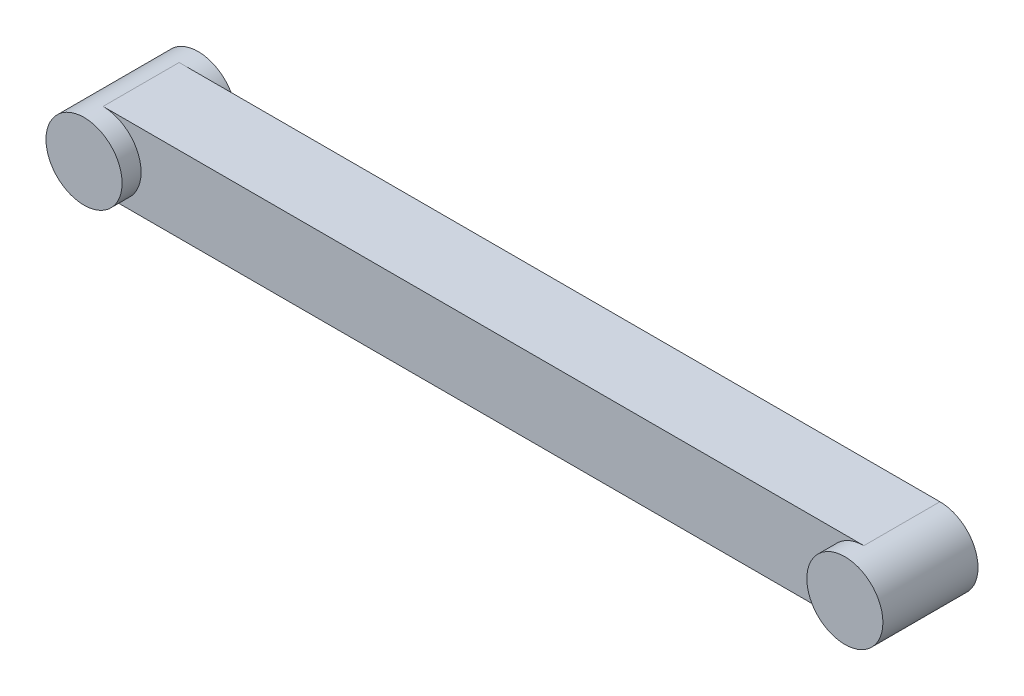
ISO-10303-21;
HEADER;
FILE_DESCRIPTION(('STEP AP214'),'2;1');
FILE_NAME('part.step','',(''),(''),'','','');
FILE_SCHEMA(('AUTOMOTIVE_DESIGN { 1 0 10303 214 1 1 1 1 }'));
ENDSEC;
DATA;
#1=APPLICATION_CONTEXT('core data for automotive mechanical design processes');
#2=APPLICATION_PROTOCOL_DEFINITION('international standard','automotive_design',2000,#1);
#3=PRODUCT_CONTEXT('',#1,'mechanical');
#4=PRODUCT('Part','Part','',(#3));
#5=PRODUCT_RELATED_PRODUCT_CATEGORY('part','',(#4));
#6=PRODUCT_DEFINITION_FORMATION('','',#4);
#7=PRODUCT_DEFINITION_CONTEXT('part definition',#1,'design');
#8=PRODUCT_DEFINITION('design','',#6,#7);
#9=PRODUCT_DEFINITION_SHAPE('','',#8);
#10=(LENGTH_UNIT() NAMED_UNIT(*) SI_UNIT(.MILLI.,.METRE.));
#11=(NAMED_UNIT(*) PLANE_ANGLE_UNIT() SI_UNIT($,.RADIAN.));
#12=(NAMED_UNIT(*) SI_UNIT($,.STERADIAN.) SOLID_ANGLE_UNIT());
#13=UNCERTAINTY_MEASURE_WITH_UNIT(LENGTH_MEASURE(1.E-05),#10,'distance_accuracy_value','');
#14=(GEOMETRIC_REPRESENTATION_CONTEXT(3) GLOBAL_UNCERTAINTY_ASSIGNED_CONTEXT((#13)) GLOBAL_UNIT_ASSIGNED_CONTEXT((#10,
#11,#12)) REPRESENTATION_CONTEXT('',''));
#15=CARTESIAN_POINT('',(0.,0.,0.));
#16=DIRECTION('',(0.,0.,1.));
#17=DIRECTION('',(1.,0.,0.));
#18=AXIS2_PLACEMENT_3D('',#15,#16,#17);
#19=CARTESIAN_POINT('',(-46.1353797157426,4.64754451051142,20.));
#20=DIRECTION('',(0.,0.,1.));
#21=DIRECTION('',(1.,0.,0.));
#22=AXIS2_PLACEMENT_3D('',#19,#20,#21);
#23=PLANE('',#22);
#24=DIRECTION('',(1.,0.,0.));
#25=VECTOR('',#24,1.);
#26=CARTESIAN_POINT('',(153.864620284257,-5.35245548948856,20.));
#27=LINE('',#26,#25);
#28=CARTESIAN_POINT('',(-46.1353797157426,-5.35245548948856,20.));
#29=VERTEX_POINT('',#28);
#30=CARTESIAN_POINT('',(153.864620284257,-5.35245548948856,20.));
#31=VERTEX_POINT('',#30);
#32=EDGE_CURVE('E62',#29,#31,#27,.T.);
#33=ORIENTED_EDGE('',*,*,#32,.T.);
#34=CARTESIAN_POINT('',(153.864620284257,4.64754451051142,20.));
#35=DIRECTION('',(0.,0.,1.));
#36=DIRECTION('',(1.,0.,0.));
#37=AXIS2_PLACEMENT_3D('',#34,#35,#36);
#38=CIRCLE('',#37,10.);
#39=CARTESIAN_POINT('',(153.864620284257,14.6475445105114,20.));
#40=VERTEX_POINT('',#39);
#41=EDGE_CURVE('E136',#40,#31,#38,.T.);
#42=ORIENTED_EDGE('',*,*,#41,.F.);
#43=DIRECTION('',(-1.,0.,0.));
#44=VECTOR('',#43,1.);
#45=CARTESIAN_POINT('',(-46.1353797157426,14.6475445105114,20.));
#46=LINE('',#45,#44);
#47=CARTESIAN_POINT('',(-46.1353797157426,14.6475445105114,20.));
#48=VERTEX_POINT('',#47);
#49=EDGE_CURVE('E100',#40,#48,#46,.T.);
#50=ORIENTED_EDGE('',*,*,#49,.T.);
#51=CARTESIAN_POINT('',(-46.1353797157426,4.64754451051142,20.));
#52=DIRECTION('',(0.,0.,1.));
#53=DIRECTION('',(1.,0.,0.));
#54=AXIS2_PLACEMENT_3D('',#51,#52,#53);
#55=CIRCLE('',#54,10.);
#56=EDGE_CURVE('E11',#29,#48,#55,.T.);
#57=ORIENTED_EDGE('',*,*,#56,.F.);
#58=EDGE_LOOP('',(#33,#42,#50,#57));
#59=FACE_BOUND('',#58,.T.);
#60=ADVANCED_FACE('F43',(#59),#23,.T.);
#61=CARTESIAN_POINT('',(-46.1353797157426,4.64754451051142,0.));
#62=DIRECTION('',(0.,0.,1.));
#63=DIRECTION('',(1.,0.,0.));
#64=AXIS2_PLACEMENT_3D('',#61,#62,#63);
#65=PLANE('',#64);
#66=CARTESIAN_POINT('',(-46.1353797157426,4.64754451051142,0.));
#67=DIRECTION('',(0.,0.,-1.));
#68=DIRECTION('',(-1.,0.,0.));
#69=AXIS2_PLACEMENT_3D('',#66,#67,#68);
#70=CIRCLE('',#69,9.99999999999999);
#71=CARTESIAN_POINT('',(-46.1353797157426,14.6475445105114,0.));
#72=VERTEX_POINT('',#71);
#73=CARTESIAN_POINT('',(-46.1353797157426,-5.35245548948856,0.));
#74=VERTEX_POINT('',#73);
#75=EDGE_CURVE('E106',#72,#74,#70,.T.);
#76=ORIENTED_EDGE('',*,*,#75,.F.);
#77=DIRECTION('',(-1.,0.,0.));
#78=VECTOR('',#77,1.);
#79=CARTESIAN_POINT('',(-46.1353797157426,14.6475445105114,0.));
#80=LINE('',#79,#78);
#81=CARTESIAN_POINT('',(153.864620284257,14.6475445105114,0.));
#82=VERTEX_POINT('',#81);
#83=EDGE_CURVE('E89',#82,#72,#80,.T.);
#84=ORIENTED_EDGE('',*,*,#83,.F.);
#85=CARTESIAN_POINT('',(153.864620284257,4.64754451051142,0.));
#86=DIRECTION('',(0.,0.,1.));
#87=DIRECTION('',(-1.,0.,0.));
#88=AXIS2_PLACEMENT_3D('',#85,#86,#87);
#89=CIRCLE('',#88,10.);
#90=CARTESIAN_POINT('',(153.864620284257,-5.35245548948856,0.));
#91=VERTEX_POINT('',#90);
#92=EDGE_CURVE('E76',#91,#82,#89,.T.);
#93=ORIENTED_EDGE('',*,*,#92,.F.);
#94=DIRECTION('',(1.,0.,0.));
#95=VECTOR('',#94,1.);
#96=CARTESIAN_POINT('',(153.864620284257,-5.35245548948856,0.));
#97=LINE('',#96,#95);
#98=EDGE_CURVE('E90',#74,#91,#97,.T.);
#99=ORIENTED_EDGE('',*,*,#98,.F.);
#100=EDGE_LOOP('',(#76,#84,#93,#99));
#101=FACE_BOUND('',#100,.T.);
#102=ADVANCED_FACE('F105',(#101),#65,.F.);
#103=CARTESIAN_POINT('',(-46.1353797157426,4.64754451051142,20.));
#104=DIRECTION('',(0.,0.,-1.));
#105=DIRECTION('',(-1.,0.,0.));
#106=AXIS2_PLACEMENT_3D('',#103,#104,#105);
#107=CYLINDRICAL_SURFACE('',#106,9.99999999999998);
#108=DIRECTION('',(0.,0.,-1.));
#109=VECTOR('',#108,1.);
#110=CARTESIAN_POINT('',(-46.1353797157426,14.6475445105114,20.));
#111=LINE('',#110,#109);
#112=EDGE_CURVE('E102',#48,#72,#111,.T.);
#113=ORIENTED_EDGE('',*,*,#112,.T.);
#114=ORIENTED_EDGE('',*,*,#75,.T.);
#115=DIRECTION('',(0.,0.,-1.));
#116=VECTOR('',#115,1.);
#117=CARTESIAN_POINT('',(-46.1353797157426,-5.35245548948856,20.));
#118=LINE('',#117,#116);
#119=EDGE_CURVE('E47',#29,#74,#118,.T.);
#120=ORIENTED_EDGE('',*,*,#119,.F.);
#121=ORIENTED_EDGE('',*,*,#56,.T.);
#122=EDGE_LOOP('',(#113,#114,#120,#121));
#123=FACE_BOUND('',#122,.T.);
#124=CARTESIAN_POINT('',(-46.1353797157426,4.64754451051142,25.));
#125=DIRECTION('',(0.,0.,1.));
#126=DIRECTION('',(1.,0.,0.));
#127=AXIS2_PLACEMENT_3D('',#124,#125,#126);
#128=CIRCLE('',#127,10.);
#129=CARTESIAN_POINT('',(-36.1353797157426,4.64754451051142,25.));
#130=VERTEX_POINT('',#129);
#131=EDGE_CURVE('E122',#130,#130,#128,.T.);
#132=ORIENTED_EDGE('',*,*,#131,.F.);
#133=EDGE_LOOP('',(#132));
#134=FACE_BOUND('',#133,.T.);
#135=CARTESIAN_POINT('',(-46.1353797157426,4.64754451051142,-5.));
#136=DIRECTION('',(0.,0.,-1.));
#137=DIRECTION('',(-1.,0.,0.));
#138=AXIS2_PLACEMENT_3D('',#135,#136,#137);
#139=CIRCLE('',#138,9.99999999999999);
#140=CARTESIAN_POINT('',(-56.1353797157426,4.64754451051142,-5.));
#141=VERTEX_POINT('',#140);
#142=EDGE_CURVE('E125',#141,#141,#139,.T.);
#143=ORIENTED_EDGE('',*,*,#142,.F.);
#144=EDGE_LOOP('',(#143));
#145=FACE_BOUND('',#144,.T.);
#146=ADVANCED_FACE('F45',(#123,#134,#145),#107,.T.);
#147=CARTESIAN_POINT('',(153.864620284257,-5.35245548948856,20.));
#148=DIRECTION('',(0.,1.,0.));
#149=DIRECTION('',(0.,0.,1.));
#150=AXIS2_PLACEMENT_3D('',#147,#148,#149);
#151=PLANE('',#150);
#152=ORIENTED_EDGE('',*,*,#98,.T.);
#153=DIRECTION('',(0.,0.,-1.));
#154=VECTOR('',#153,1.);
#155=CARTESIAN_POINT('',(153.864620284257,-5.35245548948856,20.));
#156=LINE('',#155,#154);
#157=EDGE_CURVE('E87',#31,#91,#156,.T.);
#158=ORIENTED_EDGE('',*,*,#157,.F.);
#159=ORIENTED_EDGE('',*,*,#32,.F.);
#160=ORIENTED_EDGE('',*,*,#119,.T.);
#161=EDGE_LOOP('',(#152,#158,#159,#160));
#162=FACE_BOUND('',#161,.T.);
#163=ADVANCED_FACE('F119',(#162),#151,.F.);
#164=CARTESIAN_POINT('',(153.864620284257,4.64754451051142,20.));
#165=DIRECTION('',(0.,0.,-1.));
#166=DIRECTION('',(-1.,0.,0.));
#167=AXIS2_PLACEMENT_3D('',#164,#165,#166);
#168=CYLINDRICAL_SURFACE('',#167,10.);
#169=ORIENTED_EDGE('',*,*,#92,.T.);
#170=DIRECTION('',(0.,0.,-1.));
#171=VECTOR('',#170,1.);
#172=CARTESIAN_POINT('',(153.864620284257,14.6475445105114,20.));
#173=LINE('',#172,#171);
#174=EDGE_CURVE('E86',#40,#82,#173,.T.);
#175=ORIENTED_EDGE('',*,*,#174,.F.);
#176=ORIENTED_EDGE('',*,*,#41,.T.);
#177=ORIENTED_EDGE('',*,*,#157,.T.);
#178=EDGE_LOOP('',(#169,#175,#176,#177));
#179=FACE_BOUND('',#178,.T.);
#180=CARTESIAN_POINT('',(153.864620284257,4.64754451051142,25.));
#181=DIRECTION('',(0.,0.,1.));
#182=DIRECTION('',(1.,0.,0.));
#183=AXIS2_PLACEMENT_3D('',#180,#181,#182);
#184=CIRCLE('',#183,10.);
#185=CARTESIAN_POINT('',(163.864620284257,4.64754451051142,25.));
#186=VERTEX_POINT('',#185);
#187=EDGE_CURVE('E132',#186,#186,#184,.T.);
#188=ORIENTED_EDGE('',*,*,#187,.F.);
#189=EDGE_LOOP('',(#188));
#190=FACE_BOUND('',#189,.T.);
#191=ADVANCED_FACE('F82',(#179,#190),#168,.T.);
#192=CARTESIAN_POINT('',(-46.1353797157426,14.6475445105114,20.));
#193=DIRECTION('',(0.,-1.,0.));
#194=DIRECTION('',(0.,0.,-1.));
#195=AXIS2_PLACEMENT_3D('',#192,#193,#194);
#196=PLANE('',#195);
#197=ORIENTED_EDGE('',*,*,#83,.T.);
#198=ORIENTED_EDGE('',*,*,#112,.F.);
#199=ORIENTED_EDGE('',*,*,#49,.F.);
#200=ORIENTED_EDGE('',*,*,#174,.T.);
#201=EDGE_LOOP('',(#197,#198,#199,#200));
#202=FACE_BOUND('',#201,.T.);
#203=ADVANCED_FACE('F95',(#202),#196,.F.);
#204=CARTESIAN_POINT('',(-46.1353797157426,4.64754451051142,25.));
#205=DIRECTION('',(0.,0.,1.));
#206=DIRECTION('',(1.,0.,0.));
#207=AXIS2_PLACEMENT_3D('',#204,#205,#206);
#208=PLANE('',#207);
#209=ORIENTED_EDGE('',*,*,#131,.T.);
#210=EDGE_LOOP('',(#209));
#211=FACE_BOUND('',#210,.T.);
#212=ADVANCED_FACE('F150',(#211),#208,.T.);
#213=CARTESIAN_POINT('',(-46.1353797157426,4.64754451051142,-5.));
#214=DIRECTION('',(0.,0.,-1.));
#215=DIRECTION('',(-1.,0.,0.));
#216=AXIS2_PLACEMENT_3D('',#213,#214,#215);
#217=PLANE('',#216);
#218=ORIENTED_EDGE('',*,*,#142,.T.);
#219=EDGE_LOOP('',(#218));
#220=FACE_BOUND('',#219,.T.);
#221=ADVANCED_FACE('F161',(#220),#217,.T.);
#222=CARTESIAN_POINT('',(153.864620284257,4.64754451051142,25.));
#223=DIRECTION('',(0.,0.,1.));
#224=DIRECTION('',(1.,0.,0.));
#225=AXIS2_PLACEMENT_3D('',#222,#223,#224);
#226=PLANE('',#225);
#227=ORIENTED_EDGE('',*,*,#187,.T.);
#228=EDGE_LOOP('',(#227));
#229=FACE_BOUND('',#228,.T.);
#230=ADVANCED_FACE('F143',(#229),#226,.T.);
#231=CLOSED_SHELL('',(#60,#102,#146,#163,#191,#203,#212,#221,#230));
#232=MANIFOLD_SOLID_BREP('B2',#231);
#233=ADVANCED_BREP_SHAPE_REPRESENTATION('',(#18,#232),#14);
#234=SHAPE_DEFINITION_REPRESENTATION(#9,#233);
ENDSEC;
END-ISO-10303-21;
